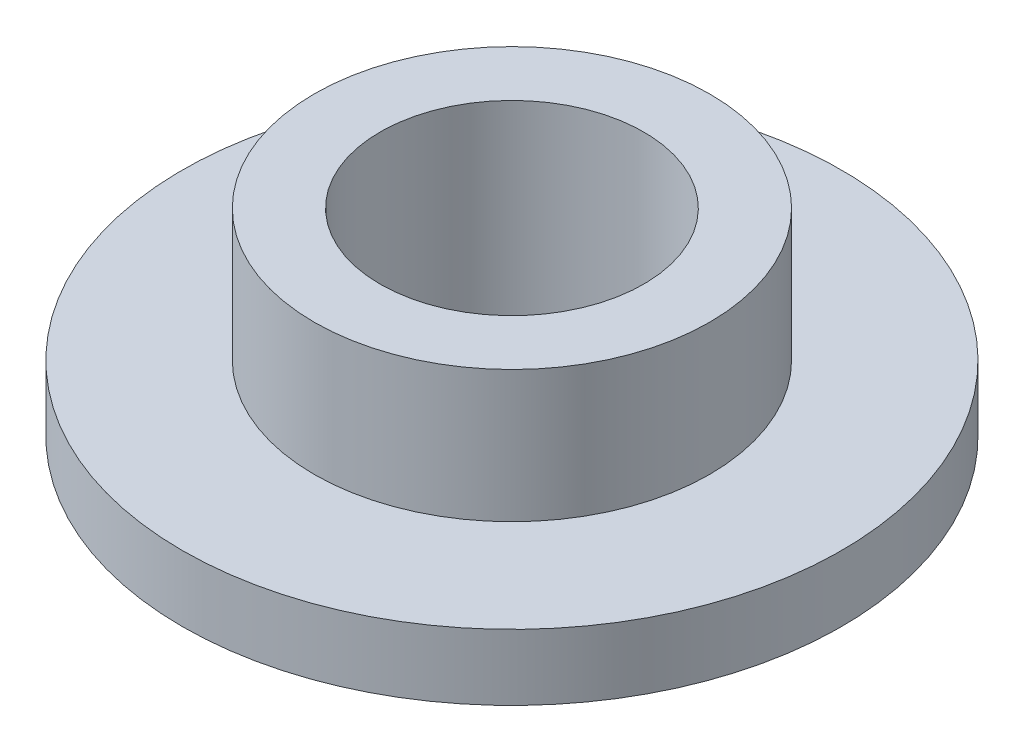
ISO-10303-21;
HEADER;
FILE_DESCRIPTION(('STEP AP214'),'2;1');
FILE_NAME('part.step','',(''),(''),'','','');
FILE_SCHEMA(('AUTOMOTIVE_DESIGN { 1 0 10303 214 1 1 1 1 }'));
ENDSEC;
DATA;
#1=APPLICATION_CONTEXT('core data for automotive mechanical design processes');
#2=APPLICATION_PROTOCOL_DEFINITION('international standard','automotive_design',2000,#1);
#3=PRODUCT_CONTEXT('',#1,'mechanical');
#4=PRODUCT('Part','Part','',(#3));
#5=PRODUCT_RELATED_PRODUCT_CATEGORY('part','',(#4));
#6=PRODUCT_DEFINITION_FORMATION('','',#4);
#7=PRODUCT_DEFINITION_CONTEXT('part definition',#1,'design');
#8=PRODUCT_DEFINITION('design','',#6,#7);
#9=PRODUCT_DEFINITION_SHAPE('','',#8);
#10=(LENGTH_UNIT() NAMED_UNIT(*) SI_UNIT(.MILLI.,.METRE.));
#11=(NAMED_UNIT(*) PLANE_ANGLE_UNIT() SI_UNIT($,.RADIAN.));
#12=(NAMED_UNIT(*) SI_UNIT($,.STERADIAN.) SOLID_ANGLE_UNIT());
#13=UNCERTAINTY_MEASURE_WITH_UNIT(LENGTH_MEASURE(1.E-05),#10,'distance_accuracy_value','');
#14=(GEOMETRIC_REPRESENTATION_CONTEXT(3) GLOBAL_UNCERTAINTY_ASSIGNED_CONTEXT((#13)) GLOBAL_UNIT_ASSIGNED_CONTEXT((#10,
#11,#12)) REPRESENTATION_CONTEXT('',''));
#15=CARTESIAN_POINT('',(0.,0.,0.));
#16=DIRECTION('',(0.,0.,1.));
#17=DIRECTION('',(1.,0.,0.));
#18=AXIS2_PLACEMENT_3D('',#15,#16,#17);
#19=CARTESIAN_POINT('',(0.,1.,0.));
#20=DIRECTION('',(0.,1.,0.));
#21=DIRECTION('',(0.,0.,1.));
#22=AXIS2_PLACEMENT_3D('',#19,#20,#21);
#23=PLANE('',#22);
#24=CARTESIAN_POINT('',(0.,1.,0.));
#25=DIRECTION('',(0.,1.,0.));
#26=DIRECTION('',(0.,0.,1.));
#27=AXIS2_PLACEMENT_3D('',#24,#25,#26);
#28=CIRCLE('',#27,5.);
#29=CARTESIAN_POINT('',(0.,1.,5.));
#30=VERTEX_POINT('',#29);
#31=EDGE_CURVE('E10',#30,#30,#28,.T.);
#32=ORIENTED_EDGE('',*,*,#31,.T.);
#33=EDGE_LOOP('',(#32));
#34=FACE_BOUND('',#33,.T.);
#35=CARTESIAN_POINT('',(0.,1.,0.));
#36=DIRECTION('',(0.,1.,0.));
#37=DIRECTION('',(0.,0.,1.));
#38=AXIS2_PLACEMENT_3D('',#35,#36,#37);
#39=CIRCLE('',#38,3.);
#40=CARTESIAN_POINT('',(0.,1.,3.));
#41=VERTEX_POINT('',#40);
#42=EDGE_CURVE('E47',#41,#41,#39,.T.);
#43=ORIENTED_EDGE('',*,*,#42,.F.);
#44=EDGE_LOOP('',(#43));
#45=FACE_BOUND('',#44,.T.);
#46=ADVANCED_FACE('F31',(#34,#45),#23,.T.);
#47=CARTESIAN_POINT('',(0.,0.,0.));
#48=DIRECTION('',(0.,1.,0.));
#49=DIRECTION('',(0.,0.,1.));
#50=AXIS2_PLACEMENT_3D('',#47,#48,#49);
#51=PLANE('',#50);
#52=CARTESIAN_POINT('',(0.,0.,0.));
#53=DIRECTION('',(0.,1.,0.));
#54=DIRECTION('',(0.,0.,1.));
#55=AXIS2_PLACEMENT_3D('',#52,#53,#54);
#56=CIRCLE('',#55,5.);
#57=CARTESIAN_POINT('',(0.,0.,5.));
#58=VERTEX_POINT('',#57);
#59=EDGE_CURVE('E35',#58,#58,#56,.T.);
#60=ORIENTED_EDGE('',*,*,#59,.F.);
#61=EDGE_LOOP('',(#60));
#62=FACE_BOUND('',#61,.T.);
#63=CARTESIAN_POINT('',(0.,0.,0.));
#64=DIRECTION('',(0.,1.,0.));
#65=DIRECTION('',(0.,0.,1.));
#66=AXIS2_PLACEMENT_3D('',#63,#64,#65);
#67=CIRCLE('',#66,2.);
#68=CARTESIAN_POINT('',(0.,0.,2.));
#69=VERTEX_POINT('',#68);
#70=EDGE_CURVE('E42',#69,#69,#67,.T.);
#71=ORIENTED_EDGE('',*,*,#70,.T.);
#72=EDGE_LOOP('',(#71));
#73=FACE_BOUND('',#72,.T.);
#74=ADVANCED_FACE('F72',(#62,#73),#51,.F.);
#75=CARTESIAN_POINT('',(0.,1.,0.));
#76=DIRECTION('',(0.,-1.,0.));
#77=DIRECTION('',(0.,0.,-1.));
#78=AXIS2_PLACEMENT_3D('',#75,#76,#77);
#79=CYLINDRICAL_SURFACE('',#78,5.);
#80=ORIENTED_EDGE('',*,*,#31,.F.);
#81=EDGE_LOOP('',(#80));
#82=FACE_BOUND('',#81,.T.);
#83=ORIENTED_EDGE('',*,*,#59,.T.);
#84=EDGE_LOOP('',(#83));
#85=FACE_BOUND('',#84,.T.);
#86=ADVANCED_FACE('F33',(#82,#85),#79,.T.);
#87=CARTESIAN_POINT('',(0.,1.,0.));
#88=DIRECTION('',(0.,-1.,0.));
#89=DIRECTION('',(0.,0.,-1.));
#90=AXIS2_PLACEMENT_3D('',#87,#88,#89);
#91=CYLINDRICAL_SURFACE('',#90,2.);
#92=ORIENTED_EDGE('',*,*,#70,.F.);
#93=EDGE_LOOP('',(#92));
#94=FACE_BOUND('',#93,.T.);
#95=CARTESIAN_POINT('',(0.,3.,0.));
#96=DIRECTION('',(0.,1.,0.));
#97=DIRECTION('',(0.,0.,1.));
#98=AXIS2_PLACEMENT_3D('',#95,#96,#97);
#99=CIRCLE('',#98,2.);
#100=CARTESIAN_POINT('',(0.,3.,2.));
#101=VERTEX_POINT('',#100);
#102=EDGE_CURVE('E50',#101,#101,#99,.T.);
#103=ORIENTED_EDGE('',*,*,#102,.T.);
#104=EDGE_LOOP('',(#103));
#105=FACE_BOUND('',#104,.T.);
#106=ADVANCED_FACE('F56',(#94,#105),#91,.F.);
#107=CARTESIAN_POINT('',(0.,3.,0.));
#108=DIRECTION('',(0.,1.,0.));
#109=DIRECTION('',(0.,0.,1.));
#110=AXIS2_PLACEMENT_3D('',#107,#108,#109);
#111=PLANE('',#110);
#112=CARTESIAN_POINT('',(0.,3.,0.));
#113=DIRECTION('',(0.,1.,0.));
#114=DIRECTION('',(0.,0.,1.));
#115=AXIS2_PLACEMENT_3D('',#112,#113,#114);
#116=CIRCLE('',#115,3.);
#117=CARTESIAN_POINT('',(0.,3.,3.));
#118=VERTEX_POINT('',#117);
#119=EDGE_CURVE('E46',#118,#118,#116,.T.);
#120=ORIENTED_EDGE('',*,*,#119,.T.);
#121=EDGE_LOOP('',(#120));
#122=FACE_BOUND('',#121,.T.);
#123=ORIENTED_EDGE('',*,*,#102,.F.);
#124=EDGE_LOOP('',(#123));
#125=FACE_BOUND('',#124,.T.);
#126=ADVANCED_FACE('F58',(#122,#125),#111,.T.);
#127=CARTESIAN_POINT('',(0.,3.,0.));
#128=DIRECTION('',(0.,-1.,0.));
#129=DIRECTION('',(0.,0.,-1.));
#130=AXIS2_PLACEMENT_3D('',#127,#128,#129);
#131=CYLINDRICAL_SURFACE('',#130,3.);
#132=ORIENTED_EDGE('',*,*,#119,.F.);
#133=EDGE_LOOP('',(#132));
#134=FACE_BOUND('',#133,.T.);
#135=ORIENTED_EDGE('',*,*,#42,.T.);
#136=EDGE_LOOP('',(#135));
#137=FACE_BOUND('',#136,.T.);
#138=ADVANCED_FACE('F60',(#134,#137),#131,.T.);
#139=CLOSED_SHELL('',(#46,#74,#86,#106,#126,#138));
#140=MANIFOLD_SOLID_BREP('B2',#139);
#141=ADVANCED_BREP_SHAPE_REPRESENTATION('',(#18,#140),#14);
#142=SHAPE_DEFINITION_REPRESENTATION(#9,#141);
ENDSEC;
END-ISO-10303-21;
